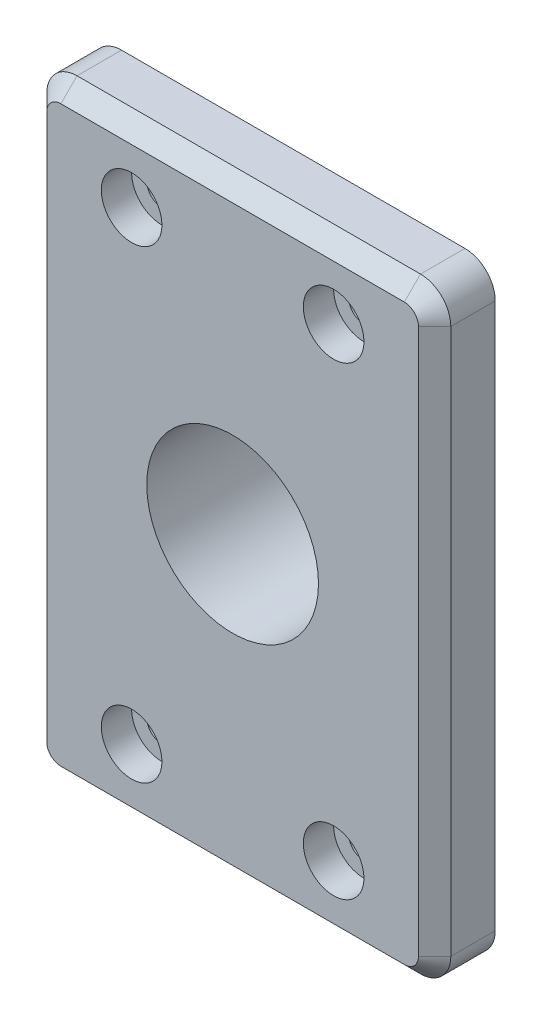
ISO-10303-21;
HEADER;
FILE_DESCRIPTION(('STEP AP214'),'2;1');
FILE_NAME('part.step','',(''),(''),'','','');
FILE_SCHEMA(('AUTOMOTIVE_DESIGN { 1 0 10303 214 1 1 1 1 }'));
ENDSEC;
DATA;
#1=APPLICATION_CONTEXT('core data for automotive mechanical design processes');
#2=APPLICATION_PROTOCOL_DEFINITION('international standard','automotive_design',2000,#1);
#3=PRODUCT_CONTEXT('',#1,'mechanical');
#4=PRODUCT('Part','Part','',(#3));
#5=PRODUCT_RELATED_PRODUCT_CATEGORY('part','',(#4));
#6=PRODUCT_DEFINITION_FORMATION('','',#4);
#7=PRODUCT_DEFINITION_CONTEXT('part definition',#1,'design');
#8=PRODUCT_DEFINITION('design','',#6,#7);
#9=PRODUCT_DEFINITION_SHAPE('','',#8);
#10=(LENGTH_UNIT() NAMED_UNIT(*) SI_UNIT(.MILLI.,.METRE.));
#11=(NAMED_UNIT(*) PLANE_ANGLE_UNIT() SI_UNIT($,.RADIAN.));
#12=(NAMED_UNIT(*) SI_UNIT($,.STERADIAN.) SOLID_ANGLE_UNIT());
#13=UNCERTAINTY_MEASURE_WITH_UNIT(LENGTH_MEASURE(1.E-05),#10,'distance_accuracy_value','');
#14=(GEOMETRIC_REPRESENTATION_CONTEXT(3) GLOBAL_UNCERTAINTY_ASSIGNED_CONTEXT((#13)) GLOBAL_UNIT_ASSIGNED_CONTEXT((#10,
#11,#12)) REPRESENTATION_CONTEXT('',''));
#15=CARTESIAN_POINT('',(0.,0.,0.));
#16=DIRECTION('',(0.,0.,1.));
#17=DIRECTION('',(1.,0.,0.));
#18=AXIS2_PLACEMENT_3D('',#15,#16,#17);
#19=CARTESIAN_POINT('',(0.,0.,0.));
#20=DIRECTION('',(0.,0.,1.));
#21=DIRECTION('',(1.,0.,0.));
#22=AXIS2_PLACEMENT_3D('',#19,#20,#21);
#23=PLANE('',#22);
#24=CARTESIAN_POINT('',(-9.99999999999999,-23.,0.));
#25=DIRECTION('',(0.,0.,1.));
#26=DIRECTION('',(-1.,0.,0.));
#27=AXIS2_PLACEMENT_3D('',#24,#25,#26);
#28=CIRCLE('',#27,1.5);
#29=CARTESIAN_POINT('',(-11.5,-23.,0.));
#30=VERTEX_POINT('',#29);
#31=EDGE_CURVE('E166',#30,#30,#28,.T.);
#32=ORIENTED_EDGE('',*,*,#31,.T.);
#33=EDGE_LOOP('',(#32));
#34=FACE_BOUND('',#33,.T.);
#35=CARTESIAN_POINT('',(10.,-23.,0.));
#36=DIRECTION('',(0.,0.,1.));
#37=DIRECTION('',(1.,0.,0.));
#38=AXIS2_PLACEMENT_3D('',#35,#36,#37);
#39=CIRCLE('',#38,1.5);
#40=CARTESIAN_POINT('',(11.5,-23.,0.));
#41=VERTEX_POINT('',#40);
#42=EDGE_CURVE('E267',#41,#41,#39,.T.);
#43=ORIENTED_EDGE('',*,*,#42,.T.);
#44=EDGE_LOOP('',(#43));
#45=FACE_BOUND('',#44,.T.);
#46=CARTESIAN_POINT('',(10.,23.,0.));
#47=DIRECTION('',(0.,0.,1.));
#48=DIRECTION('',(-1.,0.,0.));
#49=AXIS2_PLACEMENT_3D('',#46,#47,#48);
#50=CIRCLE('',#49,1.5);
#51=CARTESIAN_POINT('',(8.5,23.,0.));
#52=VERTEX_POINT('',#51);
#53=EDGE_CURVE('E270',#52,#52,#50,.T.);
#54=ORIENTED_EDGE('',*,*,#53,.T.);
#55=EDGE_LOOP('',(#54));
#56=FACE_BOUND('',#55,.T.);
#57=CARTESIAN_POINT('',(-10.,23.,0.));
#58=DIRECTION('',(0.,0.,1.));
#59=DIRECTION('',(1.,0.,0.));
#60=AXIS2_PLACEMENT_3D('',#57,#58,#59);
#61=CIRCLE('',#60,1.5);
#62=CARTESIAN_POINT('',(-8.5,23.,0.));
#63=VERTEX_POINT('',#62);
#64=EDGE_CURVE('E157',#63,#63,#61,.T.);
#65=ORIENTED_EDGE('',*,*,#64,.T.);
#66=EDGE_LOOP('',(#65));
#67=FACE_BOUND('',#66,.T.);
#68=DIRECTION('',(1.,0.,0.));
#69=VECTOR('',#68,1.);
#70=CARTESIAN_POINT('',(-20.,-30.,0.));
#71=LINE('',#70,#69);
#72=CARTESIAN_POINT('',(-17.,-30.,0.));
#73=VERTEX_POINT('',#72);
#74=CARTESIAN_POINT('',(17.,-30.,0.));
#75=VERTEX_POINT('',#74);
#76=EDGE_CURVE('E128',#73,#75,#71,.T.);
#77=ORIENTED_EDGE('',*,*,#76,.F.);
#78=CARTESIAN_POINT('',(-17.,-27.,0.));
#79=DIRECTION('',(0.,0.,1.));
#80=DIRECTION('',(1.,0.,0.));
#81=AXIS2_PLACEMENT_3D('',#78,#79,#80);
#82=CIRCLE('',#81,3.);
#83=CARTESIAN_POINT('',(-20.,-27.,0.));
#84=VERTEX_POINT('',#83);
#85=EDGE_CURVE('E138',#73,#84,#82,.F.);
#86=ORIENTED_EDGE('',*,*,#85,.T.);
#87=DIRECTION('',(0.,-1.,0.));
#88=VECTOR('',#87,1.);
#89=CARTESIAN_POINT('',(-20.,30.,0.));
#90=LINE('',#89,#88);
#91=CARTESIAN_POINT('',(-20.,27.,0.));
#92=VERTEX_POINT('',#91);
#93=EDGE_CURVE('E152',#92,#84,#90,.T.);
#94=ORIENTED_EDGE('',*,*,#93,.F.);
#95=CARTESIAN_POINT('',(-17.,27.,0.));
#96=DIRECTION('',(0.,0.,1.));
#97=DIRECTION('',(1.,0.,0.));
#98=AXIS2_PLACEMENT_3D('',#95,#96,#97);
#99=CIRCLE('',#98,3.);
#100=CARTESIAN_POINT('',(-17.,30.,0.));
#101=VERTEX_POINT('',#100);
#102=EDGE_CURVE('E181',#92,#101,#99,.F.);
#103=ORIENTED_EDGE('',*,*,#102,.T.);
#104=DIRECTION('',(-1.,0.,0.));
#105=VECTOR('',#104,1.);
#106=CARTESIAN_POINT('',(-20.,30.,0.));
#107=LINE('',#106,#105);
#108=CARTESIAN_POINT('',(17.,30.,0.));
#109=VERTEX_POINT('',#108);
#110=EDGE_CURVE('E155',#109,#101,#107,.T.);
#111=ORIENTED_EDGE('',*,*,#110,.F.);
#112=CARTESIAN_POINT('',(17.,27.,0.));
#113=DIRECTION('',(0.,0.,1.));
#114=DIRECTION('',(1.,0.,0.));
#115=AXIS2_PLACEMENT_3D('',#112,#113,#114);
#116=CIRCLE('',#115,3.);
#117=CARTESIAN_POINT('',(20.,27.,0.));
#118=VERTEX_POINT('',#117);
#119=EDGE_CURVE('E134',#109,#118,#116,.F.);
#120=ORIENTED_EDGE('',*,*,#119,.T.);
#121=DIRECTION('',(0.,1.,0.));
#122=VECTOR('',#121,1.);
#123=CARTESIAN_POINT('',(20.,30.,0.));
#124=LINE('',#123,#122);
#125=CARTESIAN_POINT('',(20.,-27.,0.));
#126=VERTEX_POINT('',#125);
#127=EDGE_CURVE('E151',#126,#118,#124,.T.);
#128=ORIENTED_EDGE('',*,*,#127,.F.);
#129=CARTESIAN_POINT('',(17.,-27.,0.));
#130=DIRECTION('',(0.,0.,1.));
#131=DIRECTION('',(1.,0.,0.));
#132=AXIS2_PLACEMENT_3D('',#129,#130,#131);
#133=CIRCLE('',#132,3.);
#134=EDGE_CURVE('E146',#126,#75,#133,.F.);
#135=ORIENTED_EDGE('',*,*,#134,.T.);
#136=EDGE_LOOP('',(#77,#86,#94,#103,#111,#120,#128,#135));
#137=FACE_BOUND('',#136,.T.);
#138=CARTESIAN_POINT('',(0.,0.,0.));
#139=DIRECTION('',(0.,0.,1.));
#140=DIRECTION('',(1.,0.,0.));
#141=AXIS2_PLACEMENT_3D('',#138,#139,#140);
#142=CIRCLE('',#141,11.5);
#143=CARTESIAN_POINT('',(11.5,0.,0.));
#144=VERTEX_POINT('',#143);
#145=EDGE_CURVE('E11',#144,#144,#142,.F.);
#146=ORIENTED_EDGE('',*,*,#145,.F.);
#147=EDGE_LOOP('',(#146));
#148=FACE_BOUND('',#147,.T.);
#149=ADVANCED_FACE('F33',(#34,#45,#56,#67,#137,#148),#23,.F.);
#150=CARTESIAN_POINT('',(10.,23.,6.));
#151=DIRECTION('',(0.,0.,-1.));
#152=DIRECTION('',(-1.,0.,0.));
#153=AXIS2_PLACEMENT_3D('',#150,#151,#152);
#154=CYLINDRICAL_SURFACE('',#153,1.5);
#155=ORIENTED_EDGE('',*,*,#53,.F.);
#156=EDGE_LOOP('',(#155));
#157=FACE_BOUND('',#156,.T.);
#158=CARTESIAN_POINT('',(10.,23.,3.));
#159=DIRECTION('',(0.,0.,1.));
#160=DIRECTION('',(1.,0.,0.));
#161=AXIS2_PLACEMENT_3D('',#158,#159,#160);
#162=CIRCLE('',#161,1.5);
#163=CARTESIAN_POINT('',(11.5,23.,3.));
#164=VERTEX_POINT('',#163);
#165=EDGE_CURVE('E175',#164,#164,#162,.T.);
#166=ORIENTED_EDGE('',*,*,#165,.T.);
#167=EDGE_LOOP('',(#166));
#168=FACE_BOUND('',#167,.T.);
#169=ADVANCED_FACE('F311',(#157,#168),#154,.F.);
#170=CARTESIAN_POINT('',(10.,-23.,6.));
#171=DIRECTION('',(0.,0.,-1.));
#172=DIRECTION('',(-1.,0.,0.));
#173=AXIS2_PLACEMENT_3D('',#170,#171,#172);
#174=CYLINDRICAL_SURFACE('',#173,1.5);
#175=ORIENTED_EDGE('',*,*,#42,.F.);
#176=EDGE_LOOP('',(#175));
#177=FACE_BOUND('',#176,.T.);
#178=CARTESIAN_POINT('',(10.,-23.,3.));
#179=DIRECTION('',(0.,0.,1.));
#180=DIRECTION('',(1.,0.,0.));
#181=AXIS2_PLACEMENT_3D('',#178,#179,#180);
#182=CIRCLE('',#181,1.5);
#183=CARTESIAN_POINT('',(11.5,-23.,3.));
#184=VERTEX_POINT('',#183);
#185=EDGE_CURVE('E171',#184,#184,#182,.T.);
#186=ORIENTED_EDGE('',*,*,#185,.T.);
#187=EDGE_LOOP('',(#186));
#188=FACE_BOUND('',#187,.T.);
#189=ADVANCED_FACE('F317',(#177,#188),#174,.F.);
#190=CARTESIAN_POINT('',(-9.99999999999999,-23.,6.));
#191=DIRECTION('',(0.,0.,-1.));
#192=DIRECTION('',(-1.,0.,0.));
#193=AXIS2_PLACEMENT_3D('',#190,#191,#192);
#194=CYLINDRICAL_SURFACE('',#193,1.5);
#195=ORIENTED_EDGE('',*,*,#31,.F.);
#196=EDGE_LOOP('',(#195));
#197=FACE_BOUND('',#196,.T.);
#198=CARTESIAN_POINT('',(-9.99999999999999,-23.,3.));
#199=DIRECTION('',(0.,0.,1.));
#200=DIRECTION('',(1.,0.,0.));
#201=AXIS2_PLACEMENT_3D('',#198,#199,#200);
#202=CIRCLE('',#201,1.5);
#203=CARTESIAN_POINT('',(-8.49999999999999,-23.,3.));
#204=VERTEX_POINT('',#203);
#205=EDGE_CURVE('E168',#204,#204,#202,.T.);
#206=ORIENTED_EDGE('',*,*,#205,.T.);
#207=EDGE_LOOP('',(#206));
#208=FACE_BOUND('',#207,.T.);
#209=ADVANCED_FACE('F280',(#197,#208),#194,.F.);
#210=CARTESIAN_POINT('',(-10.,23.,6.));
#211=DIRECTION('',(0.,0.,-1.));
#212=DIRECTION('',(-1.,0.,0.));
#213=AXIS2_PLACEMENT_3D('',#210,#211,#212);
#214=CYLINDRICAL_SURFACE('',#213,1.5);
#215=ORIENTED_EDGE('',*,*,#64,.F.);
#216=EDGE_LOOP('',(#215));
#217=FACE_BOUND('',#216,.T.);
#218=CARTESIAN_POINT('',(-10.,23.,3.));
#219=DIRECTION('',(0.,0.,1.));
#220=DIRECTION('',(1.,0.,0.));
#221=AXIS2_PLACEMENT_3D('',#218,#219,#220);
#222=CIRCLE('',#221,1.5);
#223=CARTESIAN_POINT('',(-8.5,23.,3.));
#224=VERTEX_POINT('',#223);
#225=EDGE_CURVE('E163',#224,#224,#222,.T.);
#226=ORIENTED_EDGE('',*,*,#225,.T.);
#227=EDGE_LOOP('',(#226));
#228=FACE_BOUND('',#227,.T.);
#229=ADVANCED_FACE('F276',(#217,#228),#214,.F.);
#230=CARTESIAN_POINT('',(0.,0.,6.));
#231=DIRECTION('',(0.,0.,1.));
#232=DIRECTION('',(1.,0.,0.));
#233=AXIS2_PLACEMENT_3D('',#230,#231,#232);
#234=PLANE('',#233);
#235=CARTESIAN_POINT('',(0.,0.,6.));
#236=DIRECTION('',(0.,0.,1.));
#237=DIRECTION('',(1.,0.,0.));
#238=AXIS2_PLACEMENT_3D('',#235,#236,#237);
#239=CIRCLE('',#238,8.5);
#240=CARTESIAN_POINT('',(8.5,0.,6.));
#241=VERTEX_POINT('',#240);
#242=EDGE_CURVE('E229',#241,#241,#239,.T.);
#243=ORIENTED_EDGE('',*,*,#242,.F.);
#244=EDGE_LOOP('',(#243));
#245=FACE_BOUND('',#244,.T.);
#246=CARTESIAN_POINT('',(-17.,27.,6.));
#247=DIRECTION('',(0.,0.,1.));
#248=DIRECTION('',(1.,0.,0.));
#249=AXIS2_PLACEMENT_3D('',#246,#247,#248);
#250=CIRCLE('',#249,1.4);
#251=CARTESIAN_POINT('',(-17.,28.4,6.));
#252=VERTEX_POINT('',#251);
#253=CARTESIAN_POINT('',(-18.4,27.,6.));
#254=VERTEX_POINT('',#253);
#255=EDGE_CURVE('E205',#252,#254,#250,.T.);
#256=ORIENTED_EDGE('',*,*,#255,.T.);
#257=DIRECTION('',(0.,-1.,0.));
#258=VECTOR('',#257,1.);
#259=CARTESIAN_POINT('',(-18.4,-27.,6.));
#260=LINE('',#259,#258);
#261=CARTESIAN_POINT('',(-18.4,-27.,6.));
#262=VERTEX_POINT('',#261);
#263=EDGE_CURVE('E209',#254,#262,#260,.T.);
#264=ORIENTED_EDGE('',*,*,#263,.T.);
#265=CARTESIAN_POINT('',(-17.,-27.,6.));
#266=DIRECTION('',(0.,0.,1.));
#267=DIRECTION('',(1.,0.,0.));
#268=AXIS2_PLACEMENT_3D('',#265,#266,#267);
#269=CIRCLE('',#268,1.4);
#270=CARTESIAN_POINT('',(-17.,-28.4,6.));
#271=VERTEX_POINT('',#270);
#272=EDGE_CURVE('E207',#262,#271,#269,.T.);
#273=ORIENTED_EDGE('',*,*,#272,.T.);
#274=DIRECTION('',(1.,0.,0.));
#275=VECTOR('',#274,1.);
#276=CARTESIAN_POINT('',(17.,-28.4,6.));
#277=LINE('',#276,#275);
#278=CARTESIAN_POINT('',(17.,-28.4,6.));
#279=VERTEX_POINT('',#278);
#280=EDGE_CURVE('E203',#271,#279,#277,.T.);
#281=ORIENTED_EDGE('',*,*,#280,.T.);
#282=CARTESIAN_POINT('',(17.,-27.,6.));
#283=DIRECTION('',(0.,0.,1.));
#284=DIRECTION('',(1.,0.,0.));
#285=AXIS2_PLACEMENT_3D('',#282,#283,#284);
#286=CIRCLE('',#285,1.4);
#287=CARTESIAN_POINT('',(18.4,-27.,6.));
#288=VERTEX_POINT('',#287);
#289=EDGE_CURVE('E199',#279,#288,#286,.T.);
#290=ORIENTED_EDGE('',*,*,#289,.T.);
#291=DIRECTION('',(0.,1.,0.));
#292=VECTOR('',#291,1.);
#293=CARTESIAN_POINT('',(18.4,27.,6.));
#294=LINE('',#293,#292);
#295=CARTESIAN_POINT('',(18.4,27.,6.));
#296=VERTEX_POINT('',#295);
#297=EDGE_CURVE('E195',#288,#296,#294,.T.);
#298=ORIENTED_EDGE('',*,*,#297,.T.);
#299=CARTESIAN_POINT('',(17.,27.,6.));
#300=DIRECTION('',(0.,0.,1.));
#301=DIRECTION('',(1.,0.,0.));
#302=AXIS2_PLACEMENT_3D('',#299,#300,#301);
#303=CIRCLE('',#302,1.4);
#304=CARTESIAN_POINT('',(17.,28.4,6.));
#305=VERTEX_POINT('',#304);
#306=EDGE_CURVE('E197',#296,#305,#303,.T.);
#307=ORIENTED_EDGE('',*,*,#306,.T.);
#308=DIRECTION('',(-1.,0.,0.));
#309=VECTOR('',#308,1.);
#310=CARTESIAN_POINT('',(-17.,28.4,6.));
#311=LINE('',#310,#309);
#312=EDGE_CURVE('E201',#305,#252,#311,.T.);
#313=ORIENTED_EDGE('',*,*,#312,.T.);
#314=EDGE_LOOP('',(#256,#264,#273,#281,#290,#298,#307,#313));
#315=FACE_BOUND('',#314,.T.);
#316=CARTESIAN_POINT('',(10.,23.,6.));
#317=DIRECTION('',(0.,0.,1.));
#318=DIRECTION('',(1.,0.,0.));
#319=AXIS2_PLACEMENT_3D('',#316,#317,#318);
#320=CIRCLE('',#319,3.);
#321=CARTESIAN_POINT('',(13.,23.,6.));
#322=VERTEX_POINT('',#321);
#323=EDGE_CURVE('E403',#322,#322,#320,.T.);
#324=ORIENTED_EDGE('',*,*,#323,.F.);
#325=EDGE_LOOP('',(#324));
#326=FACE_BOUND('',#325,.T.);
#327=CARTESIAN_POINT('',(10.,-23.,6.));
#328=DIRECTION('',(0.,0.,1.));
#329=DIRECTION('',(1.,0.,0.));
#330=AXIS2_PLACEMENT_3D('',#327,#328,#329);
#331=CIRCLE('',#330,3.);
#332=CARTESIAN_POINT('',(13.,-23.,6.));
#333=VERTEX_POINT('',#332);
#334=EDGE_CURVE('E257',#333,#333,#331,.T.);
#335=ORIENTED_EDGE('',*,*,#334,.F.);
#336=EDGE_LOOP('',(#335));
#337=FACE_BOUND('',#336,.T.);
#338=CARTESIAN_POINT('',(-9.99999999999999,-23.,6.));
#339=DIRECTION('',(0.,0.,1.));
#340=DIRECTION('',(1.,0.,0.));
#341=AXIS2_PLACEMENT_3D('',#338,#339,#340);
#342=CIRCLE('',#341,3.);
#343=CARTESIAN_POINT('',(-6.99999999999999,-23.,6.));
#344=VERTEX_POINT('',#343);
#345=EDGE_CURVE('E247',#344,#344,#342,.T.);
#346=ORIENTED_EDGE('',*,*,#345,.F.);
#347=EDGE_LOOP('',(#346));
#348=FACE_BOUND('',#347,.T.);
#349=CARTESIAN_POINT('',(-10.,23.,6.));
#350=DIRECTION('',(0.,0.,1.));
#351=DIRECTION('',(1.,0.,0.));
#352=AXIS2_PLACEMENT_3D('',#349,#350,#351);
#353=CIRCLE('',#352,3.);
#354=CARTESIAN_POINT('',(-7.,23.,6.));
#355=VERTEX_POINT('',#354);
#356=EDGE_CURVE('E178',#355,#355,#353,.T.);
#357=ORIENTED_EDGE('',*,*,#356,.F.);
#358=EDGE_LOOP('',(#357));
#359=FACE_BOUND('',#358,.T.);
#360=ADVANCED_FACE('F279',(#245,#315,#326,#337,#348,#359),#234,.T.);
#361=CARTESIAN_POINT('',(-20.,30.,6.));
#362=DIRECTION('',(1.,0.,0.));
#363=DIRECTION('',(0.,0.,-1.));
#364=AXIS2_PLACEMENT_3D('',#361,#362,#363);
#365=PLANE('',#364);
#366=DIRECTION('',(0.,0.,-1.));
#367=VECTOR('',#366,1.);
#368=CARTESIAN_POINT('',(-20.,-27.,6.));
#369=LINE('',#368,#367);
#370=CARTESIAN_POINT('',(-20.,-27.,4.39999999999999));
#371=VERTEX_POINT('',#370);
#372=EDGE_CURVE('E141',#84,#371,#369,.F.);
#373=ORIENTED_EDGE('',*,*,#372,.T.);
#374=DIRECTION('',(0.,1.,0.));
#375=VECTOR('',#374,1.);
#376=CARTESIAN_POINT('',(-20.,27.,4.39999999999999));
#377=LINE('',#376,#375);
#378=CARTESIAN_POINT('',(-20.,27.,4.39999999999999));
#379=VERTEX_POINT('',#378);
#380=EDGE_CURVE('E212',#371,#379,#377,.T.);
#381=ORIENTED_EDGE('',*,*,#380,.T.);
#382=DIRECTION('',(0.,0.,-1.));
#383=VECTOR('',#382,1.);
#384=CARTESIAN_POINT('',(-20.,27.,6.));
#385=LINE('',#384,#383);
#386=EDGE_CURVE('E145',#379,#92,#385,.T.);
#387=ORIENTED_EDGE('',*,*,#386,.T.);
#388=ORIENTED_EDGE('',*,*,#93,.T.);
#389=EDGE_LOOP('',(#373,#381,#387,#388));
#390=FACE_BOUND('',#389,.T.);
#391=ADVANCED_FACE('F299',(#390),#365,.F.);
#392=CARTESIAN_POINT('',(-20.,-30.,6.));
#393=DIRECTION('',(0.,1.,0.));
#394=DIRECTION('',(0.,0.,1.));
#395=AXIS2_PLACEMENT_3D('',#392,#393,#394);
#396=PLANE('',#395);
#397=DIRECTION('',(0.,0.,-1.));
#398=VECTOR('',#397,1.);
#399=CARTESIAN_POINT('',(17.,-30.,6.));
#400=LINE('',#399,#398);
#401=CARTESIAN_POINT('',(17.,-30.,4.39999999999999));
#402=VERTEX_POINT('',#401);
#403=EDGE_CURVE('E135',#75,#402,#400,.F.);
#404=ORIENTED_EDGE('',*,*,#403,.T.);
#405=DIRECTION('',(-1.,0.,0.));
#406=VECTOR('',#405,1.);
#407=CARTESIAN_POINT('',(-17.,-30.,4.39999999999999));
#408=LINE('',#407,#406);
#409=CARTESIAN_POINT('',(-17.,-30.,4.39999999999999));
#410=VERTEX_POINT('',#409);
#411=EDGE_CURVE('E131',#402,#410,#408,.T.);
#412=ORIENTED_EDGE('',*,*,#411,.T.);
#413=DIRECTION('',(0.,0.,-1.));
#414=VECTOR('',#413,1.);
#415=CARTESIAN_POINT('',(-17.,-30.,6.));
#416=LINE('',#415,#414);
#417=EDGE_CURVE('E123',#410,#73,#416,.T.);
#418=ORIENTED_EDGE('',*,*,#417,.T.);
#419=ORIENTED_EDGE('',*,*,#76,.T.);
#420=EDGE_LOOP('',(#404,#412,#418,#419));
#421=FACE_BOUND('',#420,.T.);
#422=ADVANCED_FACE('F126',(#421),#396,.F.);
#423=CARTESIAN_POINT('',(20.,30.,6.));
#424=DIRECTION('',(-1.,0.,0.));
#425=DIRECTION('',(0.,0.,1.));
#426=AXIS2_PLACEMENT_3D('',#423,#424,#425);
#427=PLANE('',#426);
#428=DIRECTION('',(0.,0.,-1.));
#429=VECTOR('',#428,1.);
#430=CARTESIAN_POINT('',(20.,27.,6.));
#431=LINE('',#430,#429);
#432=CARTESIAN_POINT('',(20.,27.,4.39999999999999));
#433=VERTEX_POINT('',#432);
#434=EDGE_CURVE('E186',#118,#433,#431,.F.);
#435=ORIENTED_EDGE('',*,*,#434,.T.);
#436=DIRECTION('',(0.,-1.,0.));
#437=VECTOR('',#436,1.);
#438=CARTESIAN_POINT('',(20.,-27.,4.39999999999999));
#439=LINE('',#438,#437);
#440=CARTESIAN_POINT('',(20.,-27.,4.39999999999999));
#441=VERTEX_POINT('',#440);
#442=EDGE_CURVE('E41',#433,#441,#439,.T.);
#443=ORIENTED_EDGE('',*,*,#442,.T.);
#444=DIRECTION('',(0.,0.,-1.));
#445=VECTOR('',#444,1.);
#446=CARTESIAN_POINT('',(20.,-27.,6.));
#447=LINE('',#446,#445);
#448=EDGE_CURVE('E188',#441,#126,#447,.T.);
#449=ORIENTED_EDGE('',*,*,#448,.T.);
#450=ORIENTED_EDGE('',*,*,#127,.T.);
#451=EDGE_LOOP('',(#435,#443,#449,#450));
#452=FACE_BOUND('',#451,.T.);
#453=ADVANCED_FACE('F324',(#452),#427,.F.);
#454=CARTESIAN_POINT('',(-20.,30.,6.));
#455=DIRECTION('',(0.,-1.,0.));
#456=DIRECTION('',(0.,0.,-1.));
#457=AXIS2_PLACEMENT_3D('',#454,#455,#456);
#458=PLANE('',#457);
#459=DIRECTION('',(0.,0.,-1.));
#460=VECTOR('',#459,1.);
#461=CARTESIAN_POINT('',(-17.,30.,6.));
#462=LINE('',#461,#460);
#463=CARTESIAN_POINT('',(-17.,30.,4.39999999999999));
#464=VERTEX_POINT('',#463);
#465=EDGE_CURVE('E192',#101,#464,#462,.F.);
#466=ORIENTED_EDGE('',*,*,#465,.T.);
#467=DIRECTION('',(1.,0.,0.));
#468=VECTOR('',#467,1.);
#469=CARTESIAN_POINT('',(17.,30.,4.39999999999999));
#470=LINE('',#469,#468);
#471=CARTESIAN_POINT('',(17.,30.,4.39999999999999));
#472=VERTEX_POINT('',#471);
#473=EDGE_CURVE('E220',#464,#472,#470,.T.);
#474=ORIENTED_EDGE('',*,*,#473,.T.);
#475=DIRECTION('',(0.,0.,-1.));
#476=VECTOR('',#475,1.);
#477=CARTESIAN_POINT('',(17.,30.,6.));
#478=LINE('',#477,#476);
#479=EDGE_CURVE('E190',#472,#109,#478,.T.);
#480=ORIENTED_EDGE('',*,*,#479,.T.);
#481=ORIENTED_EDGE('',*,*,#110,.T.);
#482=EDGE_LOOP('',(#466,#474,#480,#481));
#483=FACE_BOUND('',#482,.T.);
#484=ADVANCED_FACE('F294',(#483),#458,.F.);
#485=CARTESIAN_POINT('',(-10.,23.,3.));
#486=DIRECTION('',(0.,0.,1.));
#487=DIRECTION('',(1.,0.,0.));
#488=AXIS2_PLACEMENT_3D('',#485,#486,#487);
#489=CYLINDRICAL_SURFACE('',#488,3.);
#490=CARTESIAN_POINT('',(-10.,23.,3.));
#491=DIRECTION('',(0.,0.,1.));
#492=DIRECTION('',(1.,0.,0.));
#493=AXIS2_PLACEMENT_3D('',#490,#491,#492);
#494=CIRCLE('',#493,3.);
#495=CARTESIAN_POINT('',(-7.,23.,3.));
#496=VERTEX_POINT('',#495);
#497=EDGE_CURVE('E167',#496,#496,#494,.T.);
#498=ORIENTED_EDGE('',*,*,#497,.F.);
#499=EDGE_LOOP('',(#498));
#500=FACE_BOUND('',#499,.T.);
#501=ORIENTED_EDGE('',*,*,#356,.T.);
#502=EDGE_LOOP('',(#501));
#503=FACE_BOUND('',#502,.T.);
#504=ADVANCED_FACE('F288',(#500,#503),#489,.F.);
#505=CARTESIAN_POINT('',(-10.,23.,3.));
#506=DIRECTION('',(0.,0.,1.));
#507=DIRECTION('',(1.,0.,0.));
#508=AXIS2_PLACEMENT_3D('',#505,#506,#507);
#509=PLANE('',#508);
#510=ORIENTED_EDGE('',*,*,#225,.F.);
#511=EDGE_LOOP('',(#510));
#512=FACE_BOUND('',#511,.T.);
#513=ORIENTED_EDGE('',*,*,#497,.T.);
#514=EDGE_LOOP('',(#513));
#515=FACE_BOUND('',#514,.T.);
#516=ADVANCED_FACE('F284',(#512,#515),#509,.T.);
#517=CARTESIAN_POINT('',(-9.99999999999999,-23.,3.));
#518=DIRECTION('',(0.,0.,1.));
#519=DIRECTION('',(1.,0.,0.));
#520=AXIS2_PLACEMENT_3D('',#517,#518,#519);
#521=CYLINDRICAL_SURFACE('',#520,3.);
#522=CARTESIAN_POINT('',(-9.99999999999999,-23.,3.));
#523=DIRECTION('',(0.,0.,1.));
#524=DIRECTION('',(1.,0.,0.));
#525=AXIS2_PLACEMENT_3D('',#522,#523,#524);
#526=CIRCLE('',#525,3.);
#527=CARTESIAN_POINT('',(-6.99999999999999,-23.,3.));
#528=VERTEX_POINT('',#527);
#529=EDGE_CURVE('E252',#528,#528,#526,.T.);
#530=ORIENTED_EDGE('',*,*,#529,.F.);
#531=EDGE_LOOP('',(#530));
#532=FACE_BOUND('',#531,.T.);
#533=ORIENTED_EDGE('',*,*,#345,.T.);
#534=EDGE_LOOP('',(#533));
#535=FACE_BOUND('',#534,.T.);
#536=ADVANCED_FACE('F287',(#532,#535),#521,.F.);
#537=CARTESIAN_POINT('',(-9.99999999999999,-23.,3.));
#538=DIRECTION('',(0.,0.,1.));
#539=DIRECTION('',(1.,0.,0.));
#540=AXIS2_PLACEMENT_3D('',#537,#538,#539);
#541=PLANE('',#540);
#542=ORIENTED_EDGE('',*,*,#205,.F.);
#543=EDGE_LOOP('',(#542));
#544=FACE_BOUND('',#543,.T.);
#545=ORIENTED_EDGE('',*,*,#529,.T.);
#546=EDGE_LOOP('',(#545));
#547=FACE_BOUND('',#546,.T.);
#548=ADVANCED_FACE('F453',(#544,#547),#541,.T.);
#549=CARTESIAN_POINT('',(10.,-23.,3.));
#550=DIRECTION('',(0.,0.,1.));
#551=DIRECTION('',(1.,0.,0.));
#552=AXIS2_PLACEMENT_3D('',#549,#550,#551);
#553=CYLINDRICAL_SURFACE('',#552,3.);
#554=CARTESIAN_POINT('',(10.,-23.,3.));
#555=DIRECTION('',(0.,0.,1.));
#556=DIRECTION('',(1.,0.,0.));
#557=AXIS2_PLACEMENT_3D('',#554,#555,#556);
#558=CIRCLE('',#557,3.);
#559=CARTESIAN_POINT('',(13.,-23.,3.));
#560=VERTEX_POINT('',#559);
#561=EDGE_CURVE('E408',#560,#560,#558,.T.);
#562=ORIENTED_EDGE('',*,*,#561,.F.);
#563=EDGE_LOOP('',(#562));
#564=FACE_BOUND('',#563,.T.);
#565=ORIENTED_EDGE('',*,*,#334,.T.);
#566=EDGE_LOOP('',(#565));
#567=FACE_BOUND('',#566,.T.);
#568=ADVANCED_FACE('F449',(#564,#567),#553,.F.);
#569=CARTESIAN_POINT('',(10.,-23.,3.));
#570=DIRECTION('',(0.,0.,1.));
#571=DIRECTION('',(1.,0.,0.));
#572=AXIS2_PLACEMENT_3D('',#569,#570,#571);
#573=PLANE('',#572);
#574=ORIENTED_EDGE('',*,*,#185,.F.);
#575=EDGE_LOOP('',(#574));
#576=FACE_BOUND('',#575,.T.);
#577=ORIENTED_EDGE('',*,*,#561,.T.);
#578=EDGE_LOOP('',(#577));
#579=FACE_BOUND('',#578,.T.);
#580=ADVANCED_FACE('F445',(#576,#579),#573,.T.);
#581=CARTESIAN_POINT('',(10.,23.,3.));
#582=DIRECTION('',(0.,0.,1.));
#583=DIRECTION('',(1.,0.,0.));
#584=AXIS2_PLACEMENT_3D('',#581,#582,#583);
#585=CYLINDRICAL_SURFACE('',#584,3.);
#586=CARTESIAN_POINT('',(10.,23.,3.));
#587=DIRECTION('',(0.,0.,1.));
#588=DIRECTION('',(1.,0.,0.));
#589=AXIS2_PLACEMENT_3D('',#586,#587,#588);
#590=CIRCLE('',#589,3.);
#591=CARTESIAN_POINT('',(13.,23.,3.));
#592=VERTEX_POINT('',#591);
#593=EDGE_CURVE('E172',#592,#592,#590,.T.);
#594=ORIENTED_EDGE('',*,*,#593,.F.);
#595=EDGE_LOOP('',(#594));
#596=FACE_BOUND('',#595,.T.);
#597=ORIENTED_EDGE('',*,*,#323,.T.);
#598=EDGE_LOOP('',(#597));
#599=FACE_BOUND('',#598,.T.);
#600=ADVANCED_FACE('F441',(#596,#599),#585,.F.);
#601=CARTESIAN_POINT('',(10.,23.,3.));
#602=DIRECTION('',(0.,0.,1.));
#603=DIRECTION('',(1.,0.,0.));
#604=AXIS2_PLACEMENT_3D('',#601,#602,#603);
#605=PLANE('',#604);
#606=ORIENTED_EDGE('',*,*,#165,.F.);
#607=EDGE_LOOP('',(#606));
#608=FACE_BOUND('',#607,.T.);
#609=ORIENTED_EDGE('',*,*,#593,.T.);
#610=EDGE_LOOP('',(#609));
#611=FACE_BOUND('',#610,.T.);
#612=ADVANCED_FACE('F333',(#608,#611),#605,.T.);
#613=CARTESIAN_POINT('',(-17.,-27.,6.));
#614=DIRECTION('',(0.,0.,-1.));
#615=DIRECTION('',(-1.,0.,0.));
#616=AXIS2_PLACEMENT_3D('',#613,#614,#615);
#617=CYLINDRICAL_SURFACE('',#616,3.);
#618=ORIENTED_EDGE('',*,*,#417,.F.);
#619=CARTESIAN_POINT('',(-17.,-27.,4.39999999999999));
#620=DIRECTION('',(0.,0.,1.));
#621=DIRECTION('',(1.,0.,0.));
#622=AXIS2_PLACEMENT_3D('',#619,#620,#621);
#623=CIRCLE('',#622,3.);
#624=EDGE_CURVE('E215',#410,#371,#623,.F.);
#625=ORIENTED_EDGE('',*,*,#624,.T.);
#626=ORIENTED_EDGE('',*,*,#372,.F.);
#627=ORIENTED_EDGE('',*,*,#85,.F.);
#628=EDGE_LOOP('',(#618,#625,#626,#627));
#629=FACE_BOUND('',#628,.T.);
#630=ADVANCED_FACE('F139',(#629),#617,.T.);
#631=CARTESIAN_POINT('',(17.,-27.,6.));
#632=DIRECTION('',(0.,0.,-1.));
#633=DIRECTION('',(-1.,0.,0.));
#634=AXIS2_PLACEMENT_3D('',#631,#632,#633);
#635=CYLINDRICAL_SURFACE('',#634,3.);
#636=ORIENTED_EDGE('',*,*,#448,.F.);
#637=CARTESIAN_POINT('',(17.,-27.,4.39999999999999));
#638=DIRECTION('',(0.,0.,1.));
#639=DIRECTION('',(1.,0.,0.));
#640=AXIS2_PLACEMENT_3D('',#637,#638,#639);
#641=CIRCLE('',#640,3.);
#642=EDGE_CURVE('E222',#441,#402,#641,.F.);
#643=ORIENTED_EDGE('',*,*,#642,.T.);
#644=ORIENTED_EDGE('',*,*,#403,.F.);
#645=ORIENTED_EDGE('',*,*,#134,.F.);
#646=EDGE_LOOP('',(#636,#643,#644,#645));
#647=FACE_BOUND('',#646,.T.);
#648=ADVANCED_FACE('F332',(#647),#635,.T.);
#649=CARTESIAN_POINT('',(-17.,27.,6.));
#650=DIRECTION('',(0.,0.,-1.));
#651=DIRECTION('',(-1.,0.,0.));
#652=AXIS2_PLACEMENT_3D('',#649,#650,#651);
#653=CYLINDRICAL_SURFACE('',#652,3.);
#654=ORIENTED_EDGE('',*,*,#386,.F.);
#655=CARTESIAN_POINT('',(-17.,27.,4.39999999999999));
#656=DIRECTION('',(0.,0.,1.));
#657=DIRECTION('',(1.,0.,0.));
#658=AXIS2_PLACEMENT_3D('',#655,#656,#657);
#659=CIRCLE('',#658,3.);
#660=EDGE_CURVE('E217',#379,#464,#659,.F.);
#661=ORIENTED_EDGE('',*,*,#660,.T.);
#662=ORIENTED_EDGE('',*,*,#465,.F.);
#663=ORIENTED_EDGE('',*,*,#102,.F.);
#664=EDGE_LOOP('',(#654,#661,#662,#663));
#665=FACE_BOUND('',#664,.T.);
#666=ADVANCED_FACE('F336',(#665),#653,.T.);
#667=CARTESIAN_POINT('',(17.,27.,6.));
#668=DIRECTION('',(0.,0.,-1.));
#669=DIRECTION('',(-1.,0.,0.));
#670=AXIS2_PLACEMENT_3D('',#667,#668,#669);
#671=CYLINDRICAL_SURFACE('',#670,3.);
#672=ORIENTED_EDGE('',*,*,#479,.F.);
#673=CARTESIAN_POINT('',(17.,27.,4.39999999999999));
#674=DIRECTION('',(0.,0.,1.));
#675=DIRECTION('',(1.,0.,0.));
#676=AXIS2_PLACEMENT_3D('',#673,#674,#675);
#677=CIRCLE('',#676,3.);
#678=EDGE_CURVE('E48',#472,#433,#677,.F.);
#679=ORIENTED_EDGE('',*,*,#678,.T.);
#680=ORIENTED_EDGE('',*,*,#434,.F.);
#681=ORIENTED_EDGE('',*,*,#119,.F.);
#682=EDGE_LOOP('',(#672,#679,#680,#681));
#683=FACE_BOUND('',#682,.T.);
#684=ADVANCED_FACE('F340',(#683),#671,.T.);
#685=CARTESIAN_POINT('',(18.4,0.,6.));
#686=DIRECTION('',(0.707106781186551,0.,0.707106781186544));
#687=DIRECTION('',(0.,-1.,0.));
#688=AXIS2_PLACEMENT_3D('',#685,#686,#687);
#689=PLANE('',#688);
#690=DIRECTION('',(-0.707106781186544,0.,0.707106781186551));
#691=VECTOR('',#690,1.);
#692=CARTESIAN_POINT('',(20.,-27.,4.39999999999999));
#693=LINE('',#692,#691);
#694=EDGE_CURVE('E243',#441,#288,#693,.T.);
#695=ORIENTED_EDGE('',*,*,#694,.F.);
#696=ORIENTED_EDGE('',*,*,#442,.F.);
#697=DIRECTION('',(0.707106781186544,0.,-0.707106781186551));
#698=VECTOR('',#697,1.);
#699=CARTESIAN_POINT('',(18.4,27.,6.));
#700=LINE('',#699,#698);
#701=EDGE_CURVE('E245',#296,#433,#700,.T.);
#702=ORIENTED_EDGE('',*,*,#701,.F.);
#703=ORIENTED_EDGE('',*,*,#297,.F.);
#704=EDGE_LOOP('',(#695,#696,#702,#703));
#705=FACE_BOUND('',#704,.T.);
#706=ADVANCED_FACE('F35',(#705),#689,.T.);
#707=CARTESIAN_POINT('',(17.,27.,6.));
#708=DIRECTION('',(0.,0.,-1.));
#709=DIRECTION('',(-1.,0.,0.));
#710=AXIS2_PLACEMENT_3D('',#707,#708,#709);
#711=CONICAL_SURFACE('',#710,1.4,0.785398163397444);
#712=ORIENTED_EDGE('',*,*,#701,.T.);
#713=ORIENTED_EDGE('',*,*,#678,.F.);
#714=DIRECTION('',(0.,0.707106781186544,-0.707106781186551));
#715=VECTOR('',#714,1.);
#716=CARTESIAN_POINT('',(17.,28.4,6.));
#717=LINE('',#716,#715);
#718=EDGE_CURVE('E240',#305,#472,#717,.T.);
#719=ORIENTED_EDGE('',*,*,#718,.F.);
#720=ORIENTED_EDGE('',*,*,#306,.F.);
#721=EDGE_LOOP('',(#712,#713,#719,#720));
#722=FACE_BOUND('',#721,.T.);
#723=ADVANCED_FACE('F367',(#722),#711,.T.);
#724=CARTESIAN_POINT('',(17.,-27.,6.));
#725=DIRECTION('',(0.,0.,-1.));
#726=DIRECTION('',(-1.,0.,0.));
#727=AXIS2_PLACEMENT_3D('',#724,#725,#726);
#728=CONICAL_SURFACE('',#727,1.4,0.785398163397444);
#729=ORIENTED_EDGE('',*,*,#694,.T.);
#730=ORIENTED_EDGE('',*,*,#289,.F.);
#731=DIRECTION('',(0.,0.707106781186544,0.707106781186551));
#732=VECTOR('',#731,1.);
#733=CARTESIAN_POINT('',(17.,-30.,4.39999999999999));
#734=LINE('',#733,#732);
#735=EDGE_CURVE('E237',#402,#279,#734,.T.);
#736=ORIENTED_EDGE('',*,*,#735,.F.);
#737=ORIENTED_EDGE('',*,*,#642,.F.);
#738=EDGE_LOOP('',(#729,#730,#736,#737));
#739=FACE_BOUND('',#738,.T.);
#740=ADVANCED_FACE('F364',(#739),#728,.T.);
#741=CARTESIAN_POINT('',(0.,28.4,6.));
#742=DIRECTION('',(0.,0.707106781186551,0.707106781186544));
#743=DIRECTION('',(1.,0.,0.));
#744=AXIS2_PLACEMENT_3D('',#741,#742,#743);
#745=PLANE('',#744);
#746=ORIENTED_EDGE('',*,*,#718,.T.);
#747=ORIENTED_EDGE('',*,*,#473,.F.);
#748=DIRECTION('',(0.,0.707106781186544,-0.707106781186551));
#749=VECTOR('',#748,1.);
#750=CARTESIAN_POINT('',(-17.,28.4,6.));
#751=LINE('',#750,#749);
#752=EDGE_CURVE('E234',#252,#464,#751,.T.);
#753=ORIENTED_EDGE('',*,*,#752,.F.);
#754=ORIENTED_EDGE('',*,*,#312,.F.);
#755=EDGE_LOOP('',(#746,#747,#753,#754));
#756=FACE_BOUND('',#755,.T.);
#757=ADVANCED_FACE('F360',(#756),#745,.T.);
#758=CARTESIAN_POINT('',(0.,-28.4,6.));
#759=DIRECTION('',(0.,-0.707106781186551,0.707106781186544));
#760=DIRECTION('',(-1.,0.,0.));
#761=AXIS2_PLACEMENT_3D('',#758,#759,#760);
#762=PLANE('',#761);
#763=ORIENTED_EDGE('',*,*,#735,.T.);
#764=ORIENTED_EDGE('',*,*,#280,.F.);
#765=DIRECTION('',(0.,0.707106781186544,0.707106781186551));
#766=VECTOR('',#765,1.);
#767=CARTESIAN_POINT('',(-17.,-30.,4.39999999999999));
#768=LINE('',#767,#766);
#769=EDGE_CURVE('E231',#410,#271,#768,.T.);
#770=ORIENTED_EDGE('',*,*,#769,.F.);
#771=ORIENTED_EDGE('',*,*,#411,.F.);
#772=EDGE_LOOP('',(#763,#764,#770,#771));
#773=FACE_BOUND('',#772,.T.);
#774=ADVANCED_FACE('F356',(#773),#762,.T.);
#775=CARTESIAN_POINT('',(-17.,27.,6.));
#776=DIRECTION('',(0.,0.,-1.));
#777=DIRECTION('',(-1.,0.,0.));
#778=AXIS2_PLACEMENT_3D('',#775,#776,#777);
#779=CONICAL_SURFACE('',#778,1.4,0.785398163397444);
#780=ORIENTED_EDGE('',*,*,#752,.T.);
#781=ORIENTED_EDGE('',*,*,#660,.F.);
#782=DIRECTION('',(-0.707106781186544,0.,-0.707106781186551));
#783=VECTOR('',#782,1.);
#784=CARTESIAN_POINT('',(-18.4,27.,6.));
#785=LINE('',#784,#783);
#786=EDGE_CURVE('E228',#254,#379,#785,.T.);
#787=ORIENTED_EDGE('',*,*,#786,.F.);
#788=ORIENTED_EDGE('',*,*,#255,.F.);
#789=EDGE_LOOP('',(#780,#781,#787,#788));
#790=FACE_BOUND('',#789,.T.);
#791=ADVANCED_FACE('F352',(#790),#779,.T.);
#792=CARTESIAN_POINT('',(-17.,-27.,6.));
#793=DIRECTION('',(0.,0.,-1.));
#794=DIRECTION('',(-1.,0.,0.));
#795=AXIS2_PLACEMENT_3D('',#792,#793,#794);
#796=CONICAL_SURFACE('',#795,1.4,0.785398163397444);
#797=ORIENTED_EDGE('',*,*,#769,.T.);
#798=ORIENTED_EDGE('',*,*,#272,.F.);
#799=DIRECTION('',(0.707106781186544,0.,0.707106781186551));
#800=VECTOR('',#799,1.);
#801=CARTESIAN_POINT('',(-20.,-27.,4.39999999999999));
#802=LINE('',#801,#800);
#803=EDGE_CURVE('E226',#371,#262,#802,.T.);
#804=ORIENTED_EDGE('',*,*,#803,.F.);
#805=ORIENTED_EDGE('',*,*,#624,.F.);
#806=EDGE_LOOP('',(#797,#798,#804,#805));
#807=FACE_BOUND('',#806,.T.);
#808=ADVANCED_FACE('F348',(#807),#796,.T.);
#809=CARTESIAN_POINT('',(-18.4,0.,6.));
#810=DIRECTION('',(-0.707106781186551,0.,0.707106781186544));
#811=DIRECTION('',(0.,1.,0.));
#812=AXIS2_PLACEMENT_3D('',#809,#810,#811);
#813=PLANE('',#812);
#814=ORIENTED_EDGE('',*,*,#786,.T.);
#815=ORIENTED_EDGE('',*,*,#380,.F.);
#816=ORIENTED_EDGE('',*,*,#803,.T.);
#817=ORIENTED_EDGE('',*,*,#263,.F.);
#818=EDGE_LOOP('',(#814,#815,#816,#817));
#819=FACE_BOUND('',#818,.T.);
#820=ADVANCED_FACE('F344',(#819),#813,.T.);
#821=CARTESIAN_POINT('',(0.,0.,0.));
#822=DIRECTION('',(0.,0.,1.));
#823=DIRECTION('',(1.,0.,0.));
#824=AXIS2_PLACEMENT_3D('',#821,#822,#823);
#825=CYLINDRICAL_SURFACE('',#824,8.5);
#826=ORIENTED_EDGE('',*,*,#242,.T.);
#827=EDGE_LOOP('',(#826));
#828=FACE_BOUND('',#827,.T.);
#829=CARTESIAN_POINT('',(0.,0.,-6.));
#830=DIRECTION('',(0.,0.,-1.));
#831=DIRECTION('',(-1.,0.,0.));
#832=AXIS2_PLACEMENT_3D('',#829,#830,#831);
#833=CIRCLE('',#832,8.5);
#834=CARTESIAN_POINT('',(-8.5,0.,-6.));
#835=VERTEX_POINT('',#834);
#836=EDGE_CURVE('E420',#835,#835,#833,.T.);
#837=ORIENTED_EDGE('',*,*,#836,.T.);
#838=EDGE_LOOP('',(#837));
#839=FACE_BOUND('',#838,.T.);
#840=ADVANCED_FACE('F347',(#828,#839),#825,.F.);
#841=CARTESIAN_POINT('',(0.,0.,-6.));
#842=DIRECTION('',(0.,0.,-1.));
#843=DIRECTION('',(-1.,0.,0.));
#844=AXIS2_PLACEMENT_3D('',#841,#842,#843);
#845=PLANE('',#844);
#846=CARTESIAN_POINT('',(0.,0.,-6.));
#847=DIRECTION('',(0.,0.,-1.));
#848=DIRECTION('',(-1.,0.,0.));
#849=AXIS2_PLACEMENT_3D('',#846,#847,#848);
#850=CIRCLE('',#849,11.5);
#851=CARTESIAN_POINT('',(-11.5,0.,-6.));
#852=VERTEX_POINT('',#851);
#853=EDGE_CURVE('E417',#852,#852,#850,.T.);
#854=ORIENTED_EDGE('',*,*,#853,.T.);
#855=EDGE_LOOP('',(#854));
#856=FACE_BOUND('',#855,.T.);
#857=ORIENTED_EDGE('',*,*,#836,.F.);
#858=EDGE_LOOP('',(#857));
#859=FACE_BOUND('',#858,.T.);
#860=ADVANCED_FACE('F425',(#856,#859),#845,.T.);
#861=CARTESIAN_POINT('',(0.,0.,-6.));
#862=DIRECTION('',(0.,0.,1.));
#863=DIRECTION('',(1.,0.,0.));
#864=AXIS2_PLACEMENT_3D('',#861,#862,#863);
#865=CYLINDRICAL_SURFACE('',#864,11.5);
#866=ORIENTED_EDGE('',*,*,#853,.F.);
#867=EDGE_LOOP('',(#866));
#868=FACE_BOUND('',#867,.T.);
#869=ORIENTED_EDGE('',*,*,#145,.T.);
#870=EDGE_LOOP('',(#869));
#871=FACE_BOUND('',#870,.T.);
#872=ADVANCED_FACE('F427',(#868,#871),#865,.T.);
#873=CLOSED_SHELL('',(#149,#169,#189,#209,#229,#360,#391,#422,#453,#484,#504,#516,#536,#548,
#568,#580,#600,#612,#630,#648,#666,#684,#706,#723,#740,#757,#774,#791,#808,#820,#840,#860,#872));
#874=MANIFOLD_SOLID_BREP('B2',#873);
#875=ADVANCED_BREP_SHAPE_REPRESENTATION('',(#18,#874),#14);
#876=SHAPE_DEFINITION_REPRESENTATION(#9,#875);
ENDSEC;
END-ISO-10303-21;
